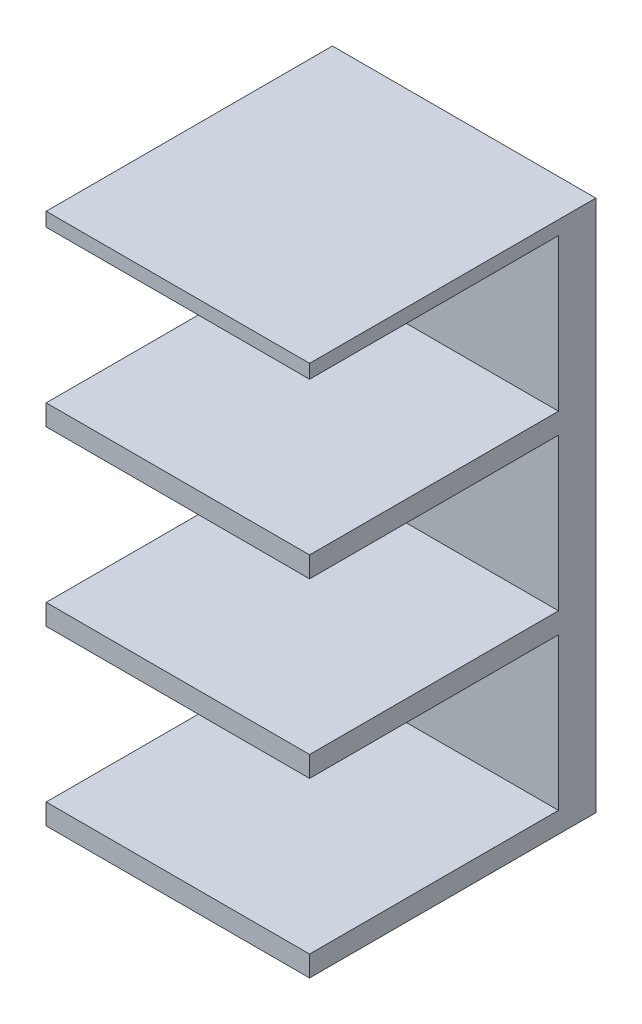
ISO-10303-21;
HEADER;
FILE_DESCRIPTION(('STEP AP214'),'2;1');
FILE_NAME('part.step','',(''),(''),'','','');
FILE_SCHEMA(('AUTOMOTIVE_DESIGN { 1 0 10303 214 1 1 1 1 }'));
ENDSEC;
DATA;
#1=APPLICATION_CONTEXT('core data for automotive mechanical design processes');
#2=APPLICATION_PROTOCOL_DEFINITION('international standard','automotive_design',2000,#1);
#3=PRODUCT_CONTEXT('',#1,'mechanical');
#4=PRODUCT('Part','Part','',(#3));
#5=PRODUCT_RELATED_PRODUCT_CATEGORY('part','',(#4));
#6=PRODUCT_DEFINITION_FORMATION('','',#4);
#7=PRODUCT_DEFINITION_CONTEXT('part definition',#1,'design');
#8=PRODUCT_DEFINITION('design','',#6,#7);
#9=PRODUCT_DEFINITION_SHAPE('','',#8);
#10=(LENGTH_UNIT() NAMED_UNIT(*) SI_UNIT(.MILLI.,.METRE.));
#11=(NAMED_UNIT(*) PLANE_ANGLE_UNIT() SI_UNIT($,.RADIAN.));
#12=(NAMED_UNIT(*) SI_UNIT($,.STERADIAN.) SOLID_ANGLE_UNIT());
#13=UNCERTAINTY_MEASURE_WITH_UNIT(LENGTH_MEASURE(1.E-05),#10,'distance_accuracy_value','');
#14=(GEOMETRIC_REPRESENTATION_CONTEXT(3) GLOBAL_UNCERTAINTY_ASSIGNED_CONTEXT((#13)) GLOBAL_UNIT_ASSIGNED_CONTEXT((#10,
#11,#12)) REPRESENTATION_CONTEXT('',''));
#15=CARTESIAN_POINT('',(0.,0.,0.));
#16=DIRECTION('',(0.,0.,1.));
#17=DIRECTION('',(1.,0.,0.));
#18=AXIS2_PLACEMENT_3D('',#15,#16,#17);
#19=CARTESIAN_POINT('',(-875.,3700.,-900.));
#20=DIRECTION('',(0.,0.,-1.));
#21=DIRECTION('',(-1.,0.,0.));
#22=AXIS2_PLACEMENT_3D('',#19,#20,#21);
#23=PLANE('',#22);
#24=DIRECTION('',(0.,-1.,0.));
#25=VECTOR('',#24,1.);
#26=CARTESIAN_POINT('',(-875.,3700.,-900.));
#27=LINE('',#26,#25);
#28=CARTESIAN_POINT('',(-875.,3600.,-900.));
#29=VERTEX_POINT('',#28);
#30=CARTESIAN_POINT('',(-875.,2500.,-900.));
#31=VERTEX_POINT('',#30);
#32=EDGE_CURVE('E257',#29,#31,#27,.T.);
#33=ORIENTED_EDGE('',*,*,#32,.T.);
#34=DIRECTION('',(-1.,0.,0.));
#35=VECTOR('',#34,1.);
#36=CARTESIAN_POINT('',(-875.,2500.,-900.));
#37=LINE('',#36,#35);
#38=CARTESIAN_POINT('',(1030.,2500.,-900.));
#39=VERTEX_POINT('',#38);
#40=EDGE_CURVE('E56',#39,#31,#37,.T.);
#41=ORIENTED_EDGE('',*,*,#40,.F.);
#42=DIRECTION('',(0.,-1.,0.));
#43=VECTOR('',#42,1.);
#44=CARTESIAN_POINT('',(1030.,2500.,-900.));
#45=LINE('',#44,#43);
#46=CARTESIAN_POINT('',(1030.,3600.,-900.));
#47=VERTEX_POINT('',#46);
#48=EDGE_CURVE('E168',#47,#39,#45,.T.);
#49=ORIENTED_EDGE('',*,*,#48,.F.);
#50=DIRECTION('',(-1.,0.,0.));
#51=VECTOR('',#50,1.);
#52=CARTESIAN_POINT('',(-875.,3600.,-900.));
#53=LINE('',#52,#51);
#54=EDGE_CURVE('E159',#47,#29,#53,.T.);
#55=ORIENTED_EDGE('',*,*,#54,.T.);
#56=EDGE_LOOP('',(#33,#41,#49,#55));
#57=FACE_BOUND('',#56,.T.);
#58=ADVANCED_FACE('F35',(#57),#23,.F.);
#59=CARTESIAN_POINT('',(-875.,2350.,-900.));
#60=VERTEX_POINT('',#59);
#61=CARTESIAN_POINT('',(-875.,1250.,-900.));
#62=VERTEX_POINT('',#61);
#63=EDGE_CURVE('E260',#60,#62,#27,.T.);
#64=ORIENTED_EDGE('',*,*,#63,.T.);
#65=DIRECTION('',(-1.,0.,0.));
#66=VECTOR('',#65,1.);
#67=CARTESIAN_POINT('',(-875.,1250.,-900.));
#68=LINE('',#67,#66);
#69=CARTESIAN_POINT('',(1030.,1250.,-900.));
#70=VERTEX_POINT('',#69);
#71=EDGE_CURVE('E233',#70,#62,#68,.T.);
#72=ORIENTED_EDGE('',*,*,#71,.F.);
#73=DIRECTION('',(0.,-1.,0.));
#74=VECTOR('',#73,1.);
#75=CARTESIAN_POINT('',(1030.,1250.,-900.));
#76=LINE('',#75,#74);
#77=CARTESIAN_POINT('',(1030.,2350.,-900.));
#78=VERTEX_POINT('',#77);
#79=EDGE_CURVE('E187',#78,#70,#76,.T.);
#80=ORIENTED_EDGE('',*,*,#79,.F.);
#81=DIRECTION('',(-1.,0.,0.));
#82=VECTOR('',#81,1.);
#83=CARTESIAN_POINT('',(-875.,2350.,-900.));
#84=LINE('',#83,#82);
#85=EDGE_CURVE('E219',#78,#60,#84,.T.);
#86=ORIENTED_EDGE('',*,*,#85,.T.);
#87=EDGE_LOOP('',(#64,#72,#80,#86));
#88=FACE_BOUND('',#87,.T.);
#89=ADVANCED_FACE('F307',(#88),#23,.F.);
#90=CARTESIAN_POINT('',(-875.,-150.,900.));
#91=DIRECTION('',(0.,0.,1.));
#92=DIRECTION('',(1.,0.,0.));
#93=AXIS2_PLACEMENT_3D('',#90,#91,#92);
#94=PLANE('',#93);
#95=DIRECTION('',(1.,0.,0.));
#96=VECTOR('',#95,1.);
#97=CARTESIAN_POINT('',(-875.,-150.,900.));
#98=LINE('',#97,#96);
#99=CARTESIAN_POINT('',(-875.,-150.,900.));
#100=VERTEX_POINT('',#99);
#101=CARTESIAN_POINT('',(1030.,-150.,900.));
#102=VERTEX_POINT('',#101);
#103=EDGE_CURVE('E263',#100,#102,#98,.T.);
#104=ORIENTED_EDGE('',*,*,#103,.T.);
#105=DIRECTION('',(0.,-1.,0.));
#106=VECTOR('',#105,1.);
#107=CARTESIAN_POINT('',(1030.,-150.,900.));
#108=LINE('',#107,#106);
#109=CARTESIAN_POINT('',(1030.,0.,900.));
#110=VERTEX_POINT('',#109);
#111=EDGE_CURVE('E205',#110,#102,#108,.T.);
#112=ORIENTED_EDGE('',*,*,#111,.F.);
#113=DIRECTION('',(1.,0.,0.));
#114=VECTOR('',#113,1.);
#115=CARTESIAN_POINT('',(-875.,0.,900.));
#116=LINE('',#115,#114);
#117=CARTESIAN_POINT('',(-875.,0.,900.));
#118=VERTEX_POINT('',#117);
#119=EDGE_CURVE('E264',#118,#110,#116,.T.);
#120=ORIENTED_EDGE('',*,*,#119,.F.);
#121=DIRECTION('',(0.,1.,0.));
#122=VECTOR('',#121,1.);
#123=CARTESIAN_POINT('',(-875.,-150.,900.));
#124=LINE('',#123,#122);
#125=EDGE_CURVE('E43',#100,#118,#124,.T.);
#126=ORIENTED_EDGE('',*,*,#125,.F.);
#127=EDGE_LOOP('',(#104,#112,#120,#126));
#128=FACE_BOUND('',#127,.T.);
#129=ADVANCED_FACE('F282',(#128),#94,.T.);
#130=CARTESIAN_POINT('',(-875.,-150.,900.));
#131=DIRECTION('',(-1.,0.,0.));
#132=DIRECTION('',(0.,0.,1.));
#133=AXIS2_PLACEMENT_3D('',#130,#131,#132);
#134=PLANE('',#133);
#135=DIRECTION('',(0.,-1.,0.));
#136=VECTOR('',#135,1.);
#137=CARTESIAN_POINT('',(-875.,3700.,-1170.));
#138=LINE('',#137,#136);
#139=CARTESIAN_POINT('',(-875.,3700.,-1170.));
#140=VERTEX_POINT('',#139);
#141=CARTESIAN_POINT('',(-875.,-149.999999999999,-1170.));
#142=VERTEX_POINT('',#141);
#143=EDGE_CURVE('E253',#140,#142,#138,.T.);
#144=ORIENTED_EDGE('',*,*,#143,.T.);
#145=DIRECTION('',(0.,0.,1.));
#146=VECTOR('',#145,1.);
#147=CARTESIAN_POINT('',(-875.,-150.,900.));
#148=LINE('',#147,#146);
#149=EDGE_CURVE('E261',#142,#100,#148,.T.);
#150=ORIENTED_EDGE('',*,*,#149,.T.);
#151=ORIENTED_EDGE('',*,*,#125,.T.);
#152=DIRECTION('',(0.,0.,1.));
#153=VECTOR('',#152,1.);
#154=CARTESIAN_POINT('',(-875.,0.,900.));
#155=LINE('',#154,#153);
#156=CARTESIAN_POINT('',(-875.,0.,-900.));
#157=VERTEX_POINT('',#156);
#158=EDGE_CURVE('E267',#157,#118,#155,.T.);
#159=ORIENTED_EDGE('',*,*,#158,.F.);
#160=CARTESIAN_POINT('',(-875.,1100.,-900.));
#161=VERTEX_POINT('',#160);
#162=EDGE_CURVE('E256',#161,#157,#27,.T.);
#163=ORIENTED_EDGE('',*,*,#162,.F.);
#164=DIRECTION('',(0.,0.,1.));
#165=VECTOR('',#164,1.);
#166=CARTESIAN_POINT('',(-875.,1100.,900.));
#167=LINE('',#166,#165);
#168=CARTESIAN_POINT('',(-875.,1100.,900.));
#169=VERTEX_POINT('',#168);
#170=EDGE_CURVE('E236',#161,#169,#167,.T.);
#171=ORIENTED_EDGE('',*,*,#170,.T.);
#172=DIRECTION('',(0.,1.,0.));
#173=VECTOR('',#172,1.);
#174=CARTESIAN_POINT('',(-875.,1100.,900.));
#175=LINE('',#174,#173);
#176=CARTESIAN_POINT('',(-875.,1250.,900.));
#177=VERTEX_POINT('',#176);
#178=EDGE_CURVE('E242',#169,#177,#175,.T.);
#179=ORIENTED_EDGE('',*,*,#178,.T.);
#180=DIRECTION('',(0.,0.,1.));
#181=VECTOR('',#180,1.);
#182=CARTESIAN_POINT('',(-875.,1250.,900.));
#183=LINE('',#182,#181);
#184=EDGE_CURVE('E244',#62,#177,#183,.T.);
#185=ORIENTED_EDGE('',*,*,#184,.F.);
#186=ORIENTED_EDGE('',*,*,#63,.F.);
#187=DIRECTION('',(0.,0.,1.));
#188=VECTOR('',#187,1.);
#189=CARTESIAN_POINT('',(-875.,2350.,900.));
#190=LINE('',#189,#188);
#191=CARTESIAN_POINT('',(-875.,2350.,900.));
#192=VERTEX_POINT('',#191);
#193=EDGE_CURVE('E221',#60,#192,#190,.T.);
#194=ORIENTED_EDGE('',*,*,#193,.T.);
#195=DIRECTION('',(0.,1.,0.));
#196=VECTOR('',#195,1.);
#197=CARTESIAN_POINT('',(-875.,2350.,900.));
#198=LINE('',#197,#196);
#199=CARTESIAN_POINT('',(-875.,2500.,900.));
#200=VERTEX_POINT('',#199);
#201=EDGE_CURVE('E227',#192,#200,#198,.T.);
#202=ORIENTED_EDGE('',*,*,#201,.T.);
#203=DIRECTION('',(0.,0.,1.));
#204=VECTOR('',#203,1.);
#205=CARTESIAN_POINT('',(-875.,2500.,900.));
#206=LINE('',#205,#204);
#207=EDGE_CURVE('E229',#31,#200,#206,.T.);
#208=ORIENTED_EDGE('',*,*,#207,.F.);
#209=ORIENTED_EDGE('',*,*,#32,.F.);
#210=DIRECTION('',(0.,0.,1.));
#211=VECTOR('',#210,1.);
#212=CARTESIAN_POINT('',(-875.,3600.,-900.));
#213=LINE('',#212,#211);
#214=CARTESIAN_POINT('',(-875.,3600.,900.));
#215=VERTEX_POINT('',#214);
#216=EDGE_CURVE('E160',#29,#215,#213,.T.);
#217=ORIENTED_EDGE('',*,*,#216,.T.);
#218=DIRECTION('',(0.,-1.,0.));
#219=VECTOR('',#218,1.);
#220=CARTESIAN_POINT('',(-875.,3700.,900.));
#221=LINE('',#220,#219);
#222=CARTESIAN_POINT('',(-875.,3700.,900.));
#223=VERTEX_POINT('',#222);
#224=EDGE_CURVE('E155',#223,#215,#221,.T.);
#225=ORIENTED_EDGE('',*,*,#224,.F.);
#226=DIRECTION('',(0.,0.,1.));
#227=VECTOR('',#226,1.);
#228=CARTESIAN_POINT('',(-875.,3700.,-900.));
#229=LINE('',#228,#227);
#230=EDGE_CURVE('E249',#140,#223,#229,.T.);
#231=ORIENTED_EDGE('',*,*,#230,.F.);
#232=EDGE_LOOP('',(#144,#150,#151,#159,#163,#171,#179,#185,#186,#194,#202,#208,#209,#217,#225,#231));
#233=FACE_BOUND('',#232,.T.);
#234=ADVANCED_FACE('F37',(#233),#134,.T.);
#235=CARTESIAN_POINT('',(0.,-150.,0.));
#236=DIRECTION('',(0.,-1.,0.));
#237=DIRECTION('',(0.,0.,-1.));
#238=AXIS2_PLACEMENT_3D('',#235,#236,#237);
#239=PLANE('',#238);
#240=ORIENTED_EDGE('',*,*,#149,.F.);
#241=DIRECTION('',(-1.,0.,0.));
#242=VECTOR('',#241,1.);
#243=CARTESIAN_POINT('',(-875.,-150.,-1170.));
#244=LINE('',#243,#242);
#245=CARTESIAN_POINT('',(1030.,-150.,-1170.));
#246=VERTEX_POINT('',#245);
#247=EDGE_CURVE('E11',#246,#142,#244,.T.);
#248=ORIENTED_EDGE('',*,*,#247,.F.);
#249=DIRECTION('',(0.,0.,-1.));
#250=VECTOR('',#249,1.);
#251=CARTESIAN_POINT('',(1030.,-150.,-1170.));
#252=LINE('',#251,#250);
#253=EDGE_CURVE('E208',#102,#246,#252,.T.);
#254=ORIENTED_EDGE('',*,*,#253,.F.);
#255=ORIENTED_EDGE('',*,*,#103,.F.);
#256=EDGE_LOOP('',(#240,#248,#254,#255));
#257=FACE_BOUND('',#256,.T.);
#258=ADVANCED_FACE('F285',(#257),#239,.T.);
#259=CARTESIAN_POINT('',(0.,0.,0.));
#260=DIRECTION('',(0.,-1.,0.));
#261=DIRECTION('',(0.,0.,-1.));
#262=AXIS2_PLACEMENT_3D('',#259,#260,#261);
#263=PLANE('',#262);
#264=ORIENTED_EDGE('',*,*,#119,.T.);
#265=DIRECTION('',(0.,0.,1.));
#266=VECTOR('',#265,1.);
#267=CARTESIAN_POINT('',(1030.,0.,900.));
#268=LINE('',#267,#266);
#269=CARTESIAN_POINT('',(1030.,0.,-900.));
#270=VERTEX_POINT('',#269);
#271=EDGE_CURVE('E202',#270,#110,#268,.T.);
#272=ORIENTED_EDGE('',*,*,#271,.F.);
#273=DIRECTION('',(-1.,0.,0.));
#274=VECTOR('',#273,1.);
#275=CARTESIAN_POINT('',(-875.,0.,-900.));
#276=LINE('',#275,#274);
#277=EDGE_CURVE('E259',#270,#157,#276,.T.);
#278=ORIENTED_EDGE('',*,*,#277,.T.);
#279=ORIENTED_EDGE('',*,*,#158,.T.);
#280=EDGE_LOOP('',(#264,#272,#278,#279));
#281=FACE_BOUND('',#280,.T.);
#282=ADVANCED_FACE('F278',(#281),#263,.F.);
#283=ORIENTED_EDGE('',*,*,#162,.T.);
#284=ORIENTED_EDGE('',*,*,#277,.F.);
#285=DIRECTION('',(0.,-1.,0.));
#286=VECTOR('',#285,1.);
#287=CARTESIAN_POINT('',(1030.,0.,-900.));
#288=LINE('',#287,#286);
#289=CARTESIAN_POINT('',(1030.,1100.,-900.));
#290=VERTEX_POINT('',#289);
#291=EDGE_CURVE('E199',#290,#270,#288,.T.);
#292=ORIENTED_EDGE('',*,*,#291,.F.);
#293=DIRECTION('',(-1.,0.,0.));
#294=VECTOR('',#293,1.);
#295=CARTESIAN_POINT('',(-875.,1100.,-900.));
#296=LINE('',#295,#294);
#297=EDGE_CURVE('E234',#290,#161,#296,.T.);
#298=ORIENTED_EDGE('',*,*,#297,.T.);
#299=EDGE_LOOP('',(#283,#284,#292,#298));
#300=FACE_BOUND('',#299,.T.);
#301=ADVANCED_FACE('F310',(#300),#23,.F.);
#302=CARTESIAN_POINT('',(-875.,3700.,-1170.));
#303=DIRECTION('',(0.,0.,1.));
#304=DIRECTION('',(1.,0.,0.));
#305=AXIS2_PLACEMENT_3D('',#302,#303,#304);
#306=PLANE('',#305);
#307=ORIENTED_EDGE('',*,*,#143,.F.);
#308=DIRECTION('',(-1.,0.,0.));
#309=VECTOR('',#308,1.);
#310=CARTESIAN_POINT('',(-875.,3700.,-1170.));
#311=LINE('',#310,#309);
#312=CARTESIAN_POINT('',(1030.,3700.,-1170.));
#313=VERTEX_POINT('',#312);
#314=EDGE_CURVE('E251',#313,#140,#311,.T.);
#315=ORIENTED_EDGE('',*,*,#314,.F.);
#316=DIRECTION('',(0.,1.,0.));
#317=VECTOR('',#316,1.);
#318=CARTESIAN_POINT('',(1030.,3700.,-1170.));
#319=LINE('',#318,#317);
#320=EDGE_CURVE('E211',#246,#313,#319,.T.);
#321=ORIENTED_EDGE('',*,*,#320,.F.);
#322=ORIENTED_EDGE('',*,*,#247,.T.);
#323=EDGE_LOOP('',(#307,#315,#321,#322));
#324=FACE_BOUND('',#323,.T.);
#325=ADVANCED_FACE('F287',(#324),#306,.F.);
#326=CARTESIAN_POINT('',(0.,3700.,0.));
#327=DIRECTION('',(0.,-1.,0.));
#328=DIRECTION('',(0.,0.,-1.));
#329=AXIS2_PLACEMENT_3D('',#326,#327,#328);
#330=PLANE('',#329);
#331=DIRECTION('',(1.,0.,0.));
#332=VECTOR('',#331,1.);
#333=CARTESIAN_POINT('',(-875.,3700.,900.));
#334=LINE('',#333,#332);
#335=CARTESIAN_POINT('',(1030.,3700.,900.));
#336=VERTEX_POINT('',#335);
#337=EDGE_CURVE('E214',#223,#336,#334,.T.);
#338=ORIENTED_EDGE('',*,*,#337,.T.);
#339=DIRECTION('',(0.,0.,1.));
#340=VECTOR('',#339,1.);
#341=CARTESIAN_POINT('',(1030.,3700.,900.));
#342=LINE('',#341,#340);
#343=EDGE_CURVE('E174',#313,#336,#342,.T.);
#344=ORIENTED_EDGE('',*,*,#343,.F.);
#345=ORIENTED_EDGE('',*,*,#314,.T.);
#346=ORIENTED_EDGE('',*,*,#230,.T.);
#347=EDGE_LOOP('',(#338,#344,#345,#346));
#348=FACE_BOUND('',#347,.T.);
#349=ADVANCED_FACE('F289',(#348),#330,.F.);
#350=CARTESIAN_POINT('',(-875.,1100.,900.));
#351=DIRECTION('',(0.,0.,1.));
#352=DIRECTION('',(1.,0.,0.));
#353=AXIS2_PLACEMENT_3D('',#350,#351,#352);
#354=PLANE('',#353);
#355=DIRECTION('',(1.,0.,0.));
#356=VECTOR('',#355,1.);
#357=CARTESIAN_POINT('',(-875.,1100.,900.));
#358=LINE('',#357,#356);
#359=CARTESIAN_POINT('',(1030.,1100.,900.));
#360=VERTEX_POINT('',#359);
#361=EDGE_CURVE('E240',#169,#360,#358,.T.);
#362=ORIENTED_EDGE('',*,*,#361,.T.);
#363=DIRECTION('',(0.,-1.,0.));
#364=VECTOR('',#363,1.);
#365=CARTESIAN_POINT('',(1030.,1100.,900.));
#366=LINE('',#365,#364);
#367=CARTESIAN_POINT('',(1030.,1250.,900.));
#368=VERTEX_POINT('',#367);
#369=EDGE_CURVE('E193',#368,#360,#366,.T.);
#370=ORIENTED_EDGE('',*,*,#369,.F.);
#371=DIRECTION('',(1.,0.,0.));
#372=VECTOR('',#371,1.);
#373=CARTESIAN_POINT('',(-875.,1250.,900.));
#374=LINE('',#373,#372);
#375=EDGE_CURVE('E237',#177,#368,#374,.T.);
#376=ORIENTED_EDGE('',*,*,#375,.F.);
#377=ORIENTED_EDGE('',*,*,#178,.F.);
#378=EDGE_LOOP('',(#362,#370,#376,#377));
#379=FACE_BOUND('',#378,.T.);
#380=ADVANCED_FACE('F319',(#379),#354,.T.);
#381=CARTESIAN_POINT('',(0.,1100.,0.));
#382=DIRECTION('',(0.,-1.,0.));
#383=DIRECTION('',(0.,0.,-1.));
#384=AXIS2_PLACEMENT_3D('',#381,#382,#383);
#385=PLANE('',#384);
#386=ORIENTED_EDGE('',*,*,#170,.F.);
#387=ORIENTED_EDGE('',*,*,#297,.F.);
#388=DIRECTION('',(0.,0.,-1.));
#389=VECTOR('',#388,1.);
#390=CARTESIAN_POINT('',(1030.,1100.,-900.));
#391=LINE('',#390,#389);
#392=EDGE_CURVE('E196',#360,#290,#391,.T.);
#393=ORIENTED_EDGE('',*,*,#392,.F.);
#394=ORIENTED_EDGE('',*,*,#361,.F.);
#395=EDGE_LOOP('',(#386,#387,#393,#394));
#396=FACE_BOUND('',#395,.T.);
#397=ADVANCED_FACE('F315',(#396),#385,.T.);
#398=CARTESIAN_POINT('',(0.,1250.,0.));
#399=DIRECTION('',(0.,-1.,0.));
#400=DIRECTION('',(0.,0.,-1.));
#401=AXIS2_PLACEMENT_3D('',#398,#399,#400);
#402=PLANE('',#401);
#403=ORIENTED_EDGE('',*,*,#375,.T.);
#404=DIRECTION('',(0.,0.,1.));
#405=VECTOR('',#404,1.);
#406=CARTESIAN_POINT('',(1030.,1250.,900.));
#407=LINE('',#406,#405);
#408=EDGE_CURVE('E190',#70,#368,#407,.T.);
#409=ORIENTED_EDGE('',*,*,#408,.F.);
#410=ORIENTED_EDGE('',*,*,#71,.T.);
#411=ORIENTED_EDGE('',*,*,#184,.T.);
#412=EDGE_LOOP('',(#403,#409,#410,#411));
#413=FACE_BOUND('',#412,.T.);
#414=ADVANCED_FACE('F323',(#413),#402,.F.);
#415=CARTESIAN_POINT('',(-875.,2350.,900.));
#416=DIRECTION('',(0.,0.,1.));
#417=DIRECTION('',(1.,0.,0.));
#418=AXIS2_PLACEMENT_3D('',#415,#416,#417);
#419=PLANE('',#418);
#420=DIRECTION('',(1.,0.,0.));
#421=VECTOR('',#420,1.);
#422=CARTESIAN_POINT('',(-875.,2350.,900.));
#423=LINE('',#422,#421);
#424=CARTESIAN_POINT('',(1030.,2350.,900.));
#425=VERTEX_POINT('',#424);
#426=EDGE_CURVE('E225',#192,#425,#423,.T.);
#427=ORIENTED_EDGE('',*,*,#426,.T.);
#428=DIRECTION('',(0.,-1.,0.));
#429=VECTOR('',#428,1.);
#430=CARTESIAN_POINT('',(1030.,2350.,900.));
#431=LINE('',#430,#429);
#432=CARTESIAN_POINT('',(1030.,2500.,900.));
#433=VERTEX_POINT('',#432);
#434=EDGE_CURVE('E181',#433,#425,#431,.T.);
#435=ORIENTED_EDGE('',*,*,#434,.F.);
#436=DIRECTION('',(1.,0.,0.));
#437=VECTOR('',#436,1.);
#438=CARTESIAN_POINT('',(-875.,2500.,900.));
#439=LINE('',#438,#437);
#440=EDGE_CURVE('E222',#200,#433,#439,.T.);
#441=ORIENTED_EDGE('',*,*,#440,.F.);
#442=ORIENTED_EDGE('',*,*,#201,.F.);
#443=EDGE_LOOP('',(#427,#435,#441,#442));
#444=FACE_BOUND('',#443,.T.);
#445=ADVANCED_FACE('F297',(#444),#419,.T.);
#446=CARTESIAN_POINT('',(0.,2350.,0.));
#447=DIRECTION('',(0.,-1.,0.));
#448=DIRECTION('',(0.,0.,-1.));
#449=AXIS2_PLACEMENT_3D('',#446,#447,#448);
#450=PLANE('',#449);
#451=ORIENTED_EDGE('',*,*,#193,.F.);
#452=ORIENTED_EDGE('',*,*,#85,.F.);
#453=DIRECTION('',(0.,0.,-1.));
#454=VECTOR('',#453,1.);
#455=CARTESIAN_POINT('',(1030.,2350.,-900.));
#456=LINE('',#455,#454);
#457=EDGE_CURVE('E184',#425,#78,#456,.T.);
#458=ORIENTED_EDGE('',*,*,#457,.F.);
#459=ORIENTED_EDGE('',*,*,#426,.F.);
#460=EDGE_LOOP('',(#451,#452,#458,#459));
#461=FACE_BOUND('',#460,.T.);
#462=ADVANCED_FACE('F303',(#461),#450,.T.);
#463=CARTESIAN_POINT('',(0.,2500.,0.));
#464=DIRECTION('',(0.,-1.,0.));
#465=DIRECTION('',(0.,0.,-1.));
#466=AXIS2_PLACEMENT_3D('',#463,#464,#465);
#467=PLANE('',#466);
#468=ORIENTED_EDGE('',*,*,#440,.T.);
#469=DIRECTION('',(0.,0.,1.));
#470=VECTOR('',#469,1.);
#471=CARTESIAN_POINT('',(1030.,2500.,900.));
#472=LINE('',#471,#470);
#473=EDGE_CURVE('E178',#39,#433,#472,.T.);
#474=ORIENTED_EDGE('',*,*,#473,.F.);
#475=ORIENTED_EDGE('',*,*,#40,.T.);
#476=ORIENTED_EDGE('',*,*,#207,.T.);
#477=EDGE_LOOP('',(#468,#474,#475,#476));
#478=FACE_BOUND('',#477,.T.);
#479=ADVANCED_FACE('F294',(#478),#467,.F.);
#480=CARTESIAN_POINT('',(-875.,3700.,900.));
#481=DIRECTION('',(0.,0.,-1.));
#482=DIRECTION('',(-1.,0.,0.));
#483=AXIS2_PLACEMENT_3D('',#480,#481,#482);
#484=PLANE('',#483);
#485=DIRECTION('',(1.,0.,0.));
#486=VECTOR('',#485,1.);
#487=CARTESIAN_POINT('',(-875.,3600.,900.));
#488=LINE('',#487,#486);
#489=CARTESIAN_POINT('',(1030.,3600.,900.));
#490=VERTEX_POINT('',#489);
#491=EDGE_CURVE('E148',#215,#490,#488,.T.);
#492=ORIENTED_EDGE('',*,*,#491,.T.);
#493=DIRECTION('',(0.,-1.,0.));
#494=VECTOR('',#493,1.);
#495=CARTESIAN_POINT('',(1030.,3600.,900.));
#496=LINE('',#495,#494);
#497=EDGE_CURVE('E153',#336,#490,#496,.T.);
#498=ORIENTED_EDGE('',*,*,#497,.F.);
#499=ORIENTED_EDGE('',*,*,#337,.F.);
#500=ORIENTED_EDGE('',*,*,#224,.T.);
#501=EDGE_LOOP('',(#492,#498,#499,#500));
#502=FACE_BOUND('',#501,.T.);
#503=ADVANCED_FACE('F150',(#502),#484,.F.);
#504=CARTESIAN_POINT('',(0.,3600.,0.));
#505=DIRECTION('',(0.,1.,0.));
#506=DIRECTION('',(0.,0.,1.));
#507=AXIS2_PLACEMENT_3D('',#504,#505,#506);
#508=PLANE('',#507);
#509=ORIENTED_EDGE('',*,*,#216,.F.);
#510=ORIENTED_EDGE('',*,*,#54,.F.);
#511=DIRECTION('',(0.,0.,-1.));
#512=VECTOR('',#511,1.);
#513=CARTESIAN_POINT('',(1030.,3600.,-900.));
#514=LINE('',#513,#512);
#515=EDGE_CURVE('E163',#490,#47,#514,.T.);
#516=ORIENTED_EDGE('',*,*,#515,.F.);
#517=ORIENTED_EDGE('',*,*,#491,.F.);
#518=EDGE_LOOP('',(#509,#510,#516,#517));
#519=FACE_BOUND('',#518,.T.);
#520=ADVANCED_FACE('F164',(#519),#508,.F.);
#521=CARTESIAN_POINT('',(1030.,0.,0.));
#522=DIRECTION('',(-1.,0.,0.));
#523=DIRECTION('',(0.,0.,1.));
#524=AXIS2_PLACEMENT_3D('',#521,#522,#523);
#525=PLANE('',#524);
#526=ORIENTED_EDGE('',*,*,#497,.T.);
#527=ORIENTED_EDGE('',*,*,#515,.T.);
#528=ORIENTED_EDGE('',*,*,#48,.T.);
#529=ORIENTED_EDGE('',*,*,#473,.T.);
#530=ORIENTED_EDGE('',*,*,#434,.T.);
#531=ORIENTED_EDGE('',*,*,#457,.T.);
#532=ORIENTED_EDGE('',*,*,#79,.T.);
#533=ORIENTED_EDGE('',*,*,#408,.T.);
#534=ORIENTED_EDGE('',*,*,#369,.T.);
#535=ORIENTED_EDGE('',*,*,#392,.T.);
#536=ORIENTED_EDGE('',*,*,#291,.T.);
#537=ORIENTED_EDGE('',*,*,#271,.T.);
#538=ORIENTED_EDGE('',*,*,#111,.T.);
#539=ORIENTED_EDGE('',*,*,#253,.T.);
#540=ORIENTED_EDGE('',*,*,#320,.T.);
#541=ORIENTED_EDGE('',*,*,#343,.T.);
#542=EDGE_LOOP('',(#526,#527,#528,#529,#530,#531,#532,#533,#534,#535,#536,#537,#538,#539,#540,#541));
#543=FACE_BOUND('',#542,.T.);
#544=ADVANCED_FACE('F171',(#543),#525,.F.);
#545=CLOSED_SHELL('',(#58,#89,#129,#234,#258,#282,#301,#325,#349,#380,#397,#414,#445,#462,#479,
#503,#520,#544));
#546=MANIFOLD_SOLID_BREP('B2',#545);
#547=ADVANCED_BREP_SHAPE_REPRESENTATION('',(#18,#546),#14);
#548=SHAPE_DEFINITION_REPRESENTATION(#9,#547);
ENDSEC;
END-ISO-10303-21;
